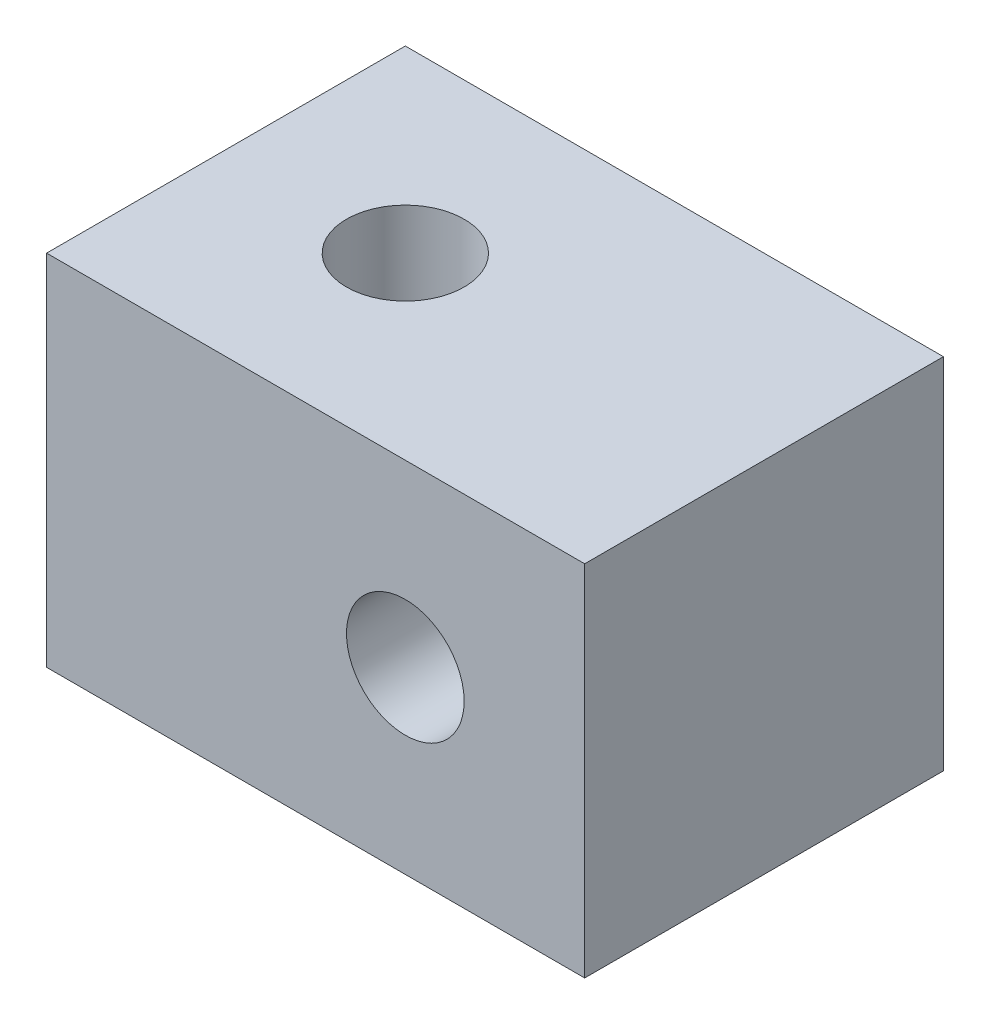
ISO-10303-21;
HEADER;
FILE_DESCRIPTION(('STEP AP214'),'2;1');
FILE_NAME('part.step','',(''),(''),'','','');
FILE_SCHEMA(('AUTOMOTIVE_DESIGN { 1 0 10303 214 1 1 1 1 }'));
ENDSEC;
DATA;
#1=APPLICATION_CONTEXT('core data for automotive mechanical design processes');
#2=APPLICATION_PROTOCOL_DEFINITION('international standard','automotive_design',2000,#1);
#3=PRODUCT_CONTEXT('',#1,'mechanical');
#4=PRODUCT('Part','Part','',(#3));
#5=PRODUCT_RELATED_PRODUCT_CATEGORY('part','',(#4));
#6=PRODUCT_DEFINITION_FORMATION('','',#4);
#7=PRODUCT_DEFINITION_CONTEXT('part definition',#1,'design');
#8=PRODUCT_DEFINITION('design','',#6,#7);
#9=PRODUCT_DEFINITION_SHAPE('','',#8);
#10=(LENGTH_UNIT() NAMED_UNIT(*) SI_UNIT(.MILLI.,.METRE.));
#11=(NAMED_UNIT(*) PLANE_ANGLE_UNIT() SI_UNIT($,.RADIAN.));
#12=(NAMED_UNIT(*) SI_UNIT($,.STERADIAN.) SOLID_ANGLE_UNIT());
#13=UNCERTAINTY_MEASURE_WITH_UNIT(LENGTH_MEASURE(1.E-05),#10,'distance_accuracy_value','');
#14=(GEOMETRIC_REPRESENTATION_CONTEXT(3) GLOBAL_UNCERTAINTY_ASSIGNED_CONTEXT((#13)) GLOBAL_UNIT_ASSIGNED_CONTEXT((#10,
#11,#12)) REPRESENTATION_CONTEXT('',''));
#15=CARTESIAN_POINT('',(0.,0.,0.));
#16=DIRECTION('',(0.,0.,1.));
#17=DIRECTION('',(1.,0.,0.));
#18=AXIS2_PLACEMENT_3D('',#15,#16,#17);
#19=CARTESIAN_POINT('',(0.,12.7,0.));
#20=DIRECTION('',(0.,-1.,0.));
#21=DIRECTION('',(0.,0.,-1.));
#22=AXIS2_PLACEMENT_3D('',#19,#20,#21);
#23=PLANE('',#22);
#24=DIRECTION('',(1.,0.,0.));
#25=VECTOR('',#24,1.);
#26=CARTESIAN_POINT('',(19.05,12.7,0.));
#27=LINE('',#26,#25);
#28=CARTESIAN_POINT('',(0.,12.7,0.));
#29=VERTEX_POINT('',#28);
#30=CARTESIAN_POINT('',(19.05,12.7,0.));
#31=VERTEX_POINT('',#30);
#32=EDGE_CURVE('E85',#29,#31,#27,.T.);
#33=ORIENTED_EDGE('',*,*,#32,.T.);
#34=DIRECTION('',(0.,0.,-1.));
#35=VECTOR('',#34,1.);
#36=CARTESIAN_POINT('',(19.05,12.7,-12.7));
#37=LINE('',#36,#35);
#38=CARTESIAN_POINT('',(19.05,12.7,-12.7));
#39=VERTEX_POINT('',#38);
#40=EDGE_CURVE('E80',#31,#39,#37,.T.);
#41=ORIENTED_EDGE('',*,*,#40,.T.);
#42=DIRECTION('',(-1.,0.,0.));
#43=VECTOR('',#42,1.);
#44=CARTESIAN_POINT('',(0.,12.7,-12.7));
#45=LINE('',#44,#43);
#46=CARTESIAN_POINT('',(0.,12.7,-12.7));
#47=VERTEX_POINT('',#46);
#48=EDGE_CURVE('E83',#39,#47,#45,.T.);
#49=ORIENTED_EDGE('',*,*,#48,.T.);
#50=DIRECTION('',(0.,0.,1.));
#51=VECTOR('',#50,1.);
#52=CARTESIAN_POINT('',(0.,12.7,0.));
#53=LINE('',#52,#51);
#54=EDGE_CURVE('E50',#47,#29,#53,.T.);
#55=ORIENTED_EDGE('',*,*,#54,.T.);
#56=EDGE_LOOP('',(#33,#41,#49,#55));
#57=FACE_BOUND('',#56,.T.);
#58=CARTESIAN_POINT('',(6.35,12.7,-6.35));
#59=DIRECTION('',(0.,1.,0.));
#60=DIRECTION('',(0.,0.,1.));
#61=AXIS2_PLACEMENT_3D('',#58,#59,#60);
#62=CIRCLE('',#61,2.0828);
#63=CARTESIAN_POINT('',(6.35,12.7,-4.2672));
#64=VERTEX_POINT('',#63);
#65=EDGE_CURVE('E100',#64,#64,#62,.T.);
#66=ORIENTED_EDGE('',*,*,#65,.F.);
#67=EDGE_LOOP('',(#66));
#68=FACE_BOUND('',#67,.T.);
#69=ADVANCED_FACE('F33',(#57,#68),#23,.F.);
#70=CARTESIAN_POINT('',(0.,0.,0.));
#71=DIRECTION('',(0.,-1.,0.));
#72=DIRECTION('',(0.,0.,-1.));
#73=AXIS2_PLACEMENT_3D('',#70,#71,#72);
#74=PLANE('',#73);
#75=DIRECTION('',(1.,0.,0.));
#76=VECTOR('',#75,1.);
#77=CARTESIAN_POINT('',(19.05,0.,0.));
#78=LINE('',#77,#76);
#79=CARTESIAN_POINT('',(0.,0.,0.));
#80=VERTEX_POINT('',#79);
#81=CARTESIAN_POINT('',(19.05,0.,0.));
#82=VERTEX_POINT('',#81);
#83=EDGE_CURVE('E97',#80,#82,#78,.T.);
#84=ORIENTED_EDGE('',*,*,#83,.F.);
#85=DIRECTION('',(0.,0.,1.));
#86=VECTOR('',#85,1.);
#87=CARTESIAN_POINT('',(0.,0.,0.));
#88=LINE('',#87,#86);
#89=CARTESIAN_POINT('',(0.,0.,-12.7));
#90=VERTEX_POINT('',#89);
#91=EDGE_CURVE('E73',#90,#80,#88,.T.);
#92=ORIENTED_EDGE('',*,*,#91,.F.);
#93=DIRECTION('',(-1.,0.,0.));
#94=VECTOR('',#93,1.);
#95=CARTESIAN_POINT('',(0.,0.,-12.7));
#96=LINE('',#95,#94);
#97=CARTESIAN_POINT('',(19.05,0.,-12.7));
#98=VERTEX_POINT('',#97);
#99=EDGE_CURVE('E67',#98,#90,#96,.T.);
#100=ORIENTED_EDGE('',*,*,#99,.F.);
#101=DIRECTION('',(0.,0.,-1.));
#102=VECTOR('',#101,1.);
#103=CARTESIAN_POINT('',(19.05,0.,-12.7));
#104=LINE('',#103,#102);
#105=EDGE_CURVE('E89',#82,#98,#104,.T.);
#106=ORIENTED_EDGE('',*,*,#105,.F.);
#107=EDGE_LOOP('',(#84,#92,#100,#106));
#108=FACE_BOUND('',#107,.T.);
#109=CARTESIAN_POINT('',(6.35,0.,-6.35));
#110=DIRECTION('',(0.,1.,0.));
#111=DIRECTION('',(0.,0.,1.));
#112=AXIS2_PLACEMENT_3D('',#109,#110,#111);
#113=CIRCLE('',#112,2.0828);
#114=CARTESIAN_POINT('',(6.35,0.,-4.2672));
#115=VERTEX_POINT('',#114);
#116=EDGE_CURVE('E112',#115,#115,#113,.T.);
#117=ORIENTED_EDGE('',*,*,#116,.T.);
#118=EDGE_LOOP('',(#117));
#119=FACE_BOUND('',#118,.T.);
#120=ADVANCED_FACE('F108',(#108,#119),#74,.T.);
#121=CARTESIAN_POINT('',(19.05,12.7,0.));
#122=DIRECTION('',(0.,0.,-1.));
#123=DIRECTION('',(-1.,0.,0.));
#124=AXIS2_PLACEMENT_3D('',#121,#122,#123);
#125=PLANE('',#124);
#126=CARTESIAN_POINT('',(12.7,6.35,0.));
#127=DIRECTION('',(0.,0.,1.));
#128=DIRECTION('',(1.,0.,0.));
#129=AXIS2_PLACEMENT_3D('',#126,#127,#128);
#130=CIRCLE('',#129,2.0828);
#131=CARTESIAN_POINT('',(14.7828,6.35,0.));
#132=VERTEX_POINT('',#131);
#133=EDGE_CURVE('E118',#132,#132,#130,.T.);
#134=ORIENTED_EDGE('',*,*,#133,.F.);
#135=EDGE_LOOP('',(#134));
#136=FACE_BOUND('',#135,.T.);
#137=ORIENTED_EDGE('',*,*,#83,.T.);
#138=DIRECTION('',(0.,-1.,0.));
#139=VECTOR('',#138,1.);
#140=CARTESIAN_POINT('',(19.05,12.7,0.));
#141=LINE('',#140,#139);
#142=EDGE_CURVE('E11',#31,#82,#141,.T.);
#143=ORIENTED_EDGE('',*,*,#142,.F.);
#144=ORIENTED_EDGE('',*,*,#32,.F.);
#145=DIRECTION('',(0.,-1.,0.));
#146=VECTOR('',#145,1.);
#147=CARTESIAN_POINT('',(0.,12.7,0.));
#148=LINE('',#147,#146);
#149=EDGE_CURVE('E93',#29,#80,#148,.T.);
#150=ORIENTED_EDGE('',*,*,#149,.T.);
#151=EDGE_LOOP('',(#137,#143,#144,#150));
#152=FACE_BOUND('',#151,.T.);
#153=ADVANCED_FACE('F35',(#136,#152),#125,.F.);
#154=CARTESIAN_POINT('',(19.05,12.7,-12.7));
#155=DIRECTION('',(-1.,0.,0.));
#156=DIRECTION('',(0.,0.,1.));
#157=AXIS2_PLACEMENT_3D('',#154,#155,#156);
#158=PLANE('',#157);
#159=ORIENTED_EDGE('',*,*,#105,.T.);
#160=DIRECTION('',(0.,-1.,0.));
#161=VECTOR('',#160,1.);
#162=CARTESIAN_POINT('',(19.05,12.7,-12.7));
#163=LINE('',#162,#161);
#164=EDGE_CURVE('E42',#39,#98,#163,.T.);
#165=ORIENTED_EDGE('',*,*,#164,.F.);
#166=ORIENTED_EDGE('',*,*,#40,.F.);
#167=ORIENTED_EDGE('',*,*,#142,.T.);
#168=EDGE_LOOP('',(#159,#165,#166,#167));
#169=FACE_BOUND('',#168,.T.);
#170=ADVANCED_FACE('F88',(#169),#158,.F.);
#171=CARTESIAN_POINT('',(0.,12.7,-12.7));
#172=DIRECTION('',(0.,0.,1.));
#173=DIRECTION('',(1.,0.,0.));
#174=AXIS2_PLACEMENT_3D('',#171,#172,#173);
#175=PLANE('',#174);
#176=CARTESIAN_POINT('',(12.7,6.35,-12.7));
#177=DIRECTION('',(0.,0.,1.));
#178=DIRECTION('',(1.,0.,0.));
#179=AXIS2_PLACEMENT_3D('',#176,#177,#178);
#180=CIRCLE('',#179,2.0828);
#181=CARTESIAN_POINT('',(14.7828,6.35,-12.7));
#182=VERTEX_POINT('',#181);
#183=EDGE_CURVE('E115',#182,#182,#180,.T.);
#184=ORIENTED_EDGE('',*,*,#183,.T.);
#185=EDGE_LOOP('',(#184));
#186=FACE_BOUND('',#185,.T.);
#187=ORIENTED_EDGE('',*,*,#99,.T.);
#188=DIRECTION('',(0.,-1.,0.));
#189=VECTOR('',#188,1.);
#190=CARTESIAN_POINT('',(0.,12.7,-12.7));
#191=LINE('',#190,#189);
#192=EDGE_CURVE('E90',#47,#90,#191,.T.);
#193=ORIENTED_EDGE('',*,*,#192,.F.);
#194=ORIENTED_EDGE('',*,*,#48,.F.);
#195=ORIENTED_EDGE('',*,*,#164,.T.);
#196=EDGE_LOOP('',(#187,#193,#194,#195));
#197=FACE_BOUND('',#196,.T.);
#198=ADVANCED_FACE('F91',(#186,#197),#175,.F.);
#199=CARTESIAN_POINT('',(0.,12.7,0.));
#200=DIRECTION('',(1.,0.,0.));
#201=DIRECTION('',(0.,0.,-1.));
#202=AXIS2_PLACEMENT_3D('',#199,#200,#201);
#203=PLANE('',#202);
#204=ORIENTED_EDGE('',*,*,#91,.T.);
#205=ORIENTED_EDGE('',*,*,#149,.F.);
#206=ORIENTED_EDGE('',*,*,#54,.F.);
#207=ORIENTED_EDGE('',*,*,#192,.T.);
#208=EDGE_LOOP('',(#204,#205,#206,#207));
#209=FACE_BOUND('',#208,.T.);
#210=ADVANCED_FACE('F105',(#209),#203,.F.);
#211=CARTESIAN_POINT('',(6.35,12.7,-6.35));
#212=DIRECTION('',(0.,-1.,0.));
#213=DIRECTION('',(0.,0.,-1.));
#214=AXIS2_PLACEMENT_3D('',#211,#212,#213);
#215=CYLINDRICAL_SURFACE('',#214,2.0828);
#216=ORIENTED_EDGE('',*,*,#65,.T.);
#217=EDGE_LOOP('',(#216));
#218=FACE_BOUND('',#217,.T.);
#219=ORIENTED_EDGE('',*,*,#116,.F.);
#220=EDGE_LOOP('',(#219));
#221=FACE_BOUND('',#220,.T.);
#222=ADVANCED_FACE('F128',(#218,#221),#215,.F.);
#223=CARTESIAN_POINT('',(12.7,6.35,-12.7));
#224=DIRECTION('',(0.,0.,1.));
#225=DIRECTION('',(1.,0.,0.));
#226=AXIS2_PLACEMENT_3D('',#223,#224,#225);
#227=CYLINDRICAL_SURFACE('',#226,2.0828);
#228=ORIENTED_EDGE('',*,*,#183,.F.);
#229=EDGE_LOOP('',(#228));
#230=FACE_BOUND('',#229,.T.);
#231=ORIENTED_EDGE('',*,*,#133,.T.);
#232=EDGE_LOOP('',(#231));
#233=FACE_BOUND('',#232,.T.);
#234=ADVANCED_FACE('F125',(#230,#233),#227,.F.);
#235=CLOSED_SHELL('',(#69,#120,#153,#170,#198,#210,#222,#234));
#236=MANIFOLD_SOLID_BREP('B2',#235);
#237=ADVANCED_BREP_SHAPE_REPRESENTATION('',(#18,#236),#14);
#238=SHAPE_DEFINITION_REPRESENTATION(#9,#237);
ENDSEC;
END-ISO-10303-21;
